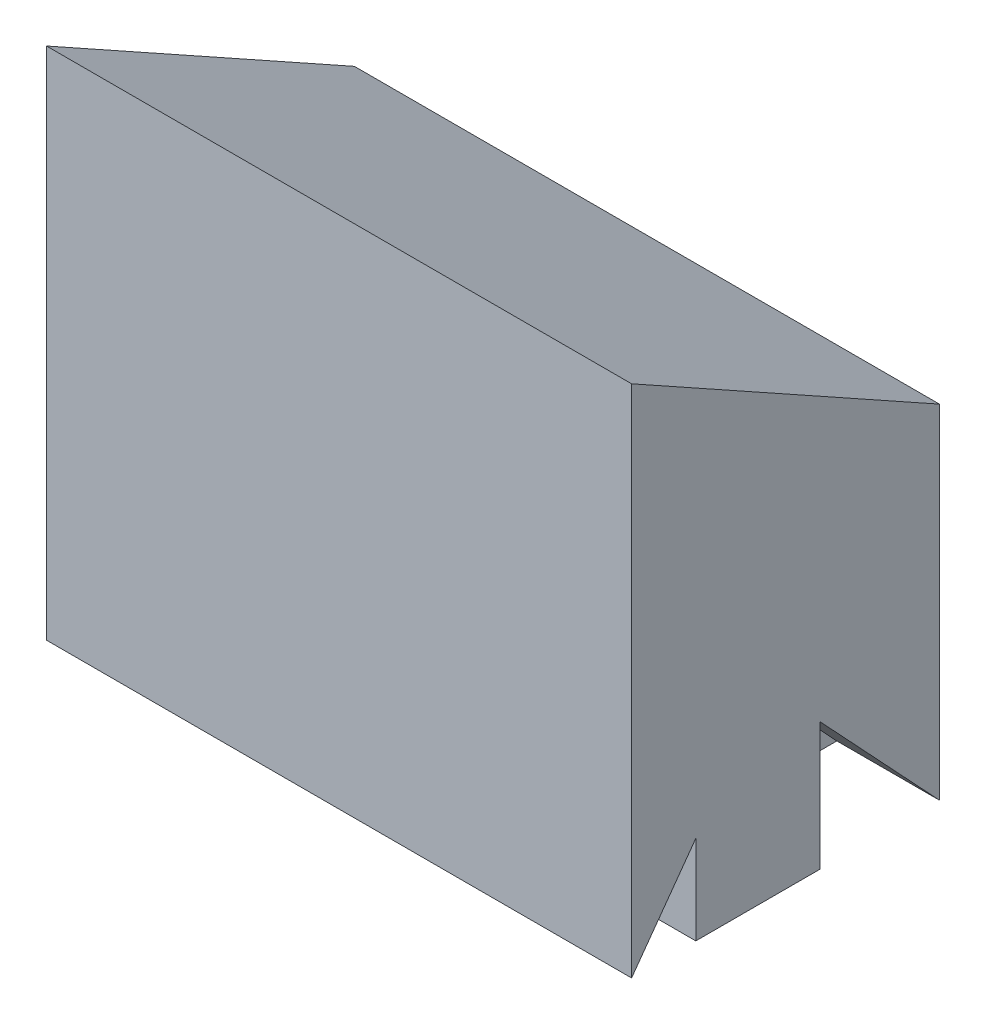
ISO-10303-21;
HEADER;
FILE_DESCRIPTION(('STEP AP214'),'2;1');
FILE_NAME('part.step','',(''),(''),'','','');
FILE_SCHEMA(('AUTOMOTIVE_DESIGN { 1 0 10303 214 1 1 1 1 }'));
ENDSEC;
DATA;
#1=APPLICATION_CONTEXT('core data for automotive mechanical design processes');
#2=APPLICATION_PROTOCOL_DEFINITION('international standard','automotive_design',2000,#1);
#3=PRODUCT_CONTEXT('',#1,'mechanical');
#4=PRODUCT('Part','Part','',(#3));
#5=PRODUCT_RELATED_PRODUCT_CATEGORY('part','',(#4));
#6=PRODUCT_DEFINITION_FORMATION('','',#4);
#7=PRODUCT_DEFINITION_CONTEXT('part definition',#1,'design');
#8=PRODUCT_DEFINITION('design','',#6,#7);
#9=PRODUCT_DEFINITION_SHAPE('','',#8);
#10=(LENGTH_UNIT() NAMED_UNIT(*) SI_UNIT(.MILLI.,.METRE.));
#11=(NAMED_UNIT(*) PLANE_ANGLE_UNIT() SI_UNIT($,.RADIAN.));
#12=(NAMED_UNIT(*) SI_UNIT($,.STERADIAN.) SOLID_ANGLE_UNIT());
#13=UNCERTAINTY_MEASURE_WITH_UNIT(LENGTH_MEASURE(1.E-05),#10,'distance_accuracy_value','');
#14=(GEOMETRIC_REPRESENTATION_CONTEXT(3) GLOBAL_UNCERTAINTY_ASSIGNED_CONTEXT((#13)) GLOBAL_UNIT_ASSIGNED_CONTEXT((#10,
#11,#12)) REPRESENTATION_CONTEXT('',''));
#15=CARTESIAN_POINT('',(0.,0.,0.));
#16=DIRECTION('',(0.,0.,1.));
#17=DIRECTION('',(1.,0.,0.));
#18=AXIS2_PLACEMENT_3D('',#15,#16,#17);
#19=CARTESIAN_POINT('',(0.,0.,30.));
#20=DIRECTION('',(0.,1.,0.));
#21=DIRECTION('',(0.,0.,1.));
#22=AXIS2_PLACEMENT_3D('',#19,#20,#21);
#23=PLANE('',#22);
#24=DIRECTION('',(0.,0.,-1.));
#25=VECTOR('',#24,1.);
#26=CARTESIAN_POINT('',(70.8577798786001,0.,30.));
#27=LINE('',#26,#25);
#28=CARTESIAN_POINT('',(70.8577798786001,0.,23.7428058885314));
#29=VERTEX_POINT('',#28);
#30=CARTESIAN_POINT('',(70.8577798786001,0.,11.6438199471961));
#31=VERTEX_POINT('',#30);
#32=EDGE_CURVE('E134',#29,#31,#27,.T.);
#33=ORIENTED_EDGE('',*,*,#32,.F.);
#34=DIRECTION('',(1.,0.,0.));
#35=VECTOR('',#34,1.);
#36=CARTESIAN_POINT('',(13.8495493312689,0.,23.7428058885314));
#37=LINE('',#36,#35);
#38=CARTESIAN_POINT('',(41.8495493312689,0.,23.7428058885314));
#39=VERTEX_POINT('',#38);
#40=EDGE_CURVE('E118',#39,#29,#37,.T.);
#41=ORIENTED_EDGE('',*,*,#40,.F.);
#42=DIRECTION('',(0.,0.,1.));
#43=VECTOR('',#42,1.);
#44=CARTESIAN_POINT('',(41.8495493312689,0.,20.2258421117634));
#45=LINE('',#44,#43);
#46=CARTESIAN_POINT('',(41.8495493312689,0.,20.2258421117634));
#47=VERTEX_POINT('',#46);
#48=EDGE_CURVE('E154',#47,#39,#45,.T.);
#49=ORIENTED_EDGE('',*,*,#48,.F.);
#50=DIRECTION('',(-1.,0.,0.));
#51=VECTOR('',#50,1.);
#52=CARTESIAN_POINT('',(41.8495493312689,0.,20.2258421117634));
#53=LINE('',#52,#51);
#54=CARTESIAN_POINT('',(13.8495493312689,0.,20.2258421117634));
#55=VERTEX_POINT('',#54);
#56=EDGE_CURVE('E170',#47,#55,#53,.T.);
#57=ORIENTED_EDGE('',*,*,#56,.T.);
#58=DIRECTION('',(0.,0.,-1.));
#59=VECTOR('',#58,1.);
#60=CARTESIAN_POINT('',(13.8495493312689,0.,30.));
#61=LINE('',#60,#59);
#62=CARTESIAN_POINT('',(13.8495493312689,0.,0.));
#63=VERTEX_POINT('',#62);
#64=EDGE_CURVE('E139',#55,#63,#61,.T.);
#65=ORIENTED_EDGE('',*,*,#64,.T.);
#66=DIRECTION('',(1.,0.,0.));
#67=VECTOR('',#66,1.);
#68=CARTESIAN_POINT('',(0.,0.,0.));
#69=LINE('',#68,#67);
#70=CARTESIAN_POINT('',(60.8577798786001,0.,0.));
#71=VERTEX_POINT('',#70);
#72=EDGE_CURVE('E205',#63,#71,#69,.T.);
#73=ORIENTED_EDGE('',*,*,#72,.T.);
#74=DIRECTION('',(0.,0.,-1.));
#75=VECTOR('',#74,1.);
#76=CARTESIAN_POINT('',(60.8577798786001,0.,0.));
#77=LINE('',#76,#75);
#78=CARTESIAN_POINT('',(60.8577798786001,0.,11.6438199471961));
#79=VERTEX_POINT('',#78);
#80=EDGE_CURVE('E58',#79,#71,#77,.T.);
#81=ORIENTED_EDGE('',*,*,#80,.F.);
#82=DIRECTION('',(1.,0.,0.));
#83=VECTOR('',#82,1.);
#84=CARTESIAN_POINT('',(60.8577798786001,0.,11.6438199471961));
#85=LINE('',#84,#83);
#86=EDGE_CURVE('E138',#79,#31,#85,.T.);
#87=ORIENTED_EDGE('',*,*,#86,.T.);
#88=EDGE_LOOP('',(#33,#41,#49,#57,#65,#73,#81,#87));
#89=FACE_BOUND('',#88,.T.);
#90=ADVANCED_FACE('F35',(#89),#23,.F.);
#91=CARTESIAN_POINT('',(70.8577798786001,0.,30.));
#92=DIRECTION('',(-1.,0.,0.));
#93=DIRECTION('',(0.,0.,1.));
#94=AXIS2_PLACEMENT_3D('',#91,#92,#93);
#95=PLANE('',#94);
#96=DIRECTION('',(0.,1.,0.));
#97=VECTOR('',#96,1.);
#98=CARTESIAN_POINT('',(70.8577798786001,0.,30.));
#99=LINE('',#98,#97);
#100=CARTESIAN_POINT('',(70.8577798786001,0.,30.));
#101=VERTEX_POINT('',#100);
#102=CARTESIAN_POINT('',(70.8577798786001,50.1420838183935,30.));
#103=VERTEX_POINT('',#102);
#104=EDGE_CURVE('E140',#101,#103,#99,.T.);
#105=ORIENTED_EDGE('',*,*,#104,.F.);
#106=DIRECTION('',(0.,-0.810438338951257,0.585823948603953));
#107=VECTOR('',#106,1.);
#108=CARTESIAN_POINT('',(70.8577798786001,0.,30.));
#109=LINE('',#108,#107);
#110=CARTESIAN_POINT('',(70.8577798786001,8.65630368010528,23.7428058885314));
#111=VERTEX_POINT('',#110);
#112=EDGE_CURVE('E128',#111,#101,#109,.T.);
#113=ORIENTED_EDGE('',*,*,#112,.F.);
#114=DIRECTION('',(0.,1.,0.));
#115=VECTOR('',#114,1.);
#116=CARTESIAN_POINT('',(70.8577798786001,8.65630368010528,23.7428058885314));
#117=LINE('',#116,#115);
#118=EDGE_CURVE('E121',#29,#111,#117,.T.);
#119=ORIENTED_EDGE('',*,*,#118,.F.);
#120=ORIENTED_EDGE('',*,*,#32,.T.);
#121=DIRECTION('',(0.,1.,0.));
#122=VECTOR('',#121,1.);
#123=CARTESIAN_POINT('',(70.8577798786001,0.,11.6438199471961));
#124=LINE('',#123,#122);
#125=CARTESIAN_POINT('',(70.8577798786001,12.4504065022994,11.6438199471961));
#126=VERTEX_POINT('',#125);
#127=EDGE_CURVE('E177',#31,#126,#124,.T.);
#128=ORIENTED_EDGE('',*,*,#127,.T.);
#129=DIRECTION('',(0.,-0.730368994284255,-0.683052803367504));
#130=VECTOR('',#129,1.);
#131=CARTESIAN_POINT('',(70.8577798786001,0.,0.));
#132=LINE('',#131,#130);
#133=CARTESIAN_POINT('',(70.8577798786001,0.,0.));
#134=VERTEX_POINT('',#133);
#135=EDGE_CURVE('E172',#126,#134,#132,.T.);
#136=ORIENTED_EDGE('',*,*,#135,.T.);
#137=DIRECTION('',(0.,1.,0.));
#138=VECTOR('',#137,1.);
#139=CARTESIAN_POINT('',(70.8577798786001,0.,0.));
#140=LINE('',#139,#138);
#141=CARTESIAN_POINT('',(70.8577798786001,33.4265318323234,0.));
#142=VERTEX_POINT('',#141);
#143=EDGE_CURVE('E147',#134,#142,#140,.T.);
#144=ORIENTED_EDGE('',*,*,#143,.T.);
#145=DIRECTION('',(0.,0.48673029562401,0.873552299133694));
#146=VECTOR('',#145,1.);
#147=CARTESIAN_POINT('',(70.8577798786001,50.1420838183935,30.));
#148=LINE('',#147,#146);
#149=EDGE_CURVE('E189',#142,#103,#148,.T.);
#150=ORIENTED_EDGE('',*,*,#149,.T.);
#151=EDGE_LOOP('',(#105,#113,#119,#120,#128,#136,#144,#150));
#152=FACE_BOUND('',#151,.T.);
#153=ADVANCED_FACE('F132',(#152),#95,.F.);
#154=CARTESIAN_POINT('',(13.8495493312689,0.,30.));
#155=DIRECTION('',(1.,0.,0.));
#156=DIRECTION('',(0.,1.,0.));
#157=AXIS2_PLACEMENT_3D('',#154,#155,#156);
#158=PLANE('',#157);
#159=ORIENTED_EDGE('',*,*,#64,.F.);
#160=DIRECTION('',(0.,-1.,0.));
#161=VECTOR('',#160,1.);
#162=CARTESIAN_POINT('',(13.8495493312689,16.6021424937348,20.2258421117634));
#163=LINE('',#162,#161);
#164=CARTESIAN_POINT('',(13.8495493312689,16.6021424937348,20.2258421117634));
#165=VERTEX_POINT('',#164);
#166=EDGE_CURVE('E159',#165,#55,#163,.T.);
#167=ORIENTED_EDGE('',*,*,#166,.F.);
#168=DIRECTION('',(0.,0.861748338110224,-0.507335985087069));
#169=VECTOR('',#168,1.);
#170=CARTESIAN_POINT('',(13.8495493312689,0.,30.));
#171=LINE('',#170,#169);
#172=CARTESIAN_POINT('',(13.8495493312689,0.,30.));
#173=VERTEX_POINT('',#172);
#174=EDGE_CURVE('E162',#173,#165,#171,.T.);
#175=ORIENTED_EDGE('',*,*,#174,.F.);
#176=DIRECTION('',(0.,-1.,0.));
#177=VECTOR('',#176,1.);
#178=CARTESIAN_POINT('',(13.8495493312689,0.,30.));
#179=LINE('',#178,#177);
#180=CARTESIAN_POINT('',(13.8495493312689,50.1420838183935,30.));
#181=VERTEX_POINT('',#180);
#182=EDGE_CURVE('E198',#181,#173,#179,.T.);
#183=ORIENTED_EDGE('',*,*,#182,.F.);
#184=DIRECTION('',(0.,0.48673029562401,0.873552299133694));
#185=VECTOR('',#184,1.);
#186=CARTESIAN_POINT('',(13.8495493312689,50.1420838183935,30.));
#187=LINE('',#186,#185);
#188=CARTESIAN_POINT('',(13.8495493312689,33.4265318323234,0.));
#189=VERTEX_POINT('',#188);
#190=EDGE_CURVE('E186',#189,#181,#187,.T.);
#191=ORIENTED_EDGE('',*,*,#190,.F.);
#192=DIRECTION('',(0.,-1.,0.));
#193=VECTOR('',#192,1.);
#194=CARTESIAN_POINT('',(13.8495493312689,0.,0.));
#195=LINE('',#194,#193);
#196=EDGE_CURVE('E195',#189,#63,#195,.T.);
#197=ORIENTED_EDGE('',*,*,#196,.T.);
#198=EDGE_LOOP('',(#159,#167,#175,#183,#191,#197));
#199=FACE_BOUND('',#198,.T.);
#200=ADVANCED_FACE('F37',(#199),#158,.F.);
#201=CARTESIAN_POINT('',(0.,0.,30.));
#202=DIRECTION('',(0.,0.,1.));
#203=DIRECTION('',(1.,0.,0.));
#204=AXIS2_PLACEMENT_3D('',#201,#202,#203);
#205=PLANE('',#204);
#206=DIRECTION('',(1.,0.,0.));
#207=VECTOR('',#206,1.);
#208=CARTESIAN_POINT('',(0.,50.1420838183935,30.));
#209=LINE('',#208,#207);
#210=EDGE_CURVE('E196',#181,#103,#209,.T.);
#211=ORIENTED_EDGE('',*,*,#210,.F.);
#212=ORIENTED_EDGE('',*,*,#182,.T.);
#213=DIRECTION('',(1.,0.,0.));
#214=VECTOR('',#213,1.);
#215=CARTESIAN_POINT('',(0.,0.,30.));
#216=LINE('',#215,#214);
#217=CARTESIAN_POINT('',(41.8495493312689,0.,30.));
#218=VERTEX_POINT('',#217);
#219=EDGE_CURVE('E144',#173,#218,#216,.T.);
#220=ORIENTED_EDGE('',*,*,#219,.T.);
#221=EDGE_CURVE('E201',#218,#101,#216,.T.);
#222=ORIENTED_EDGE('',*,*,#221,.T.);
#223=ORIENTED_EDGE('',*,*,#104,.T.);
#224=EDGE_LOOP('',(#211,#212,#220,#222,#223));
#225=FACE_BOUND('',#224,.T.);
#226=ADVANCED_FACE('F226',(#225),#205,.T.);
#227=CARTESIAN_POINT('',(0.,0.,0.));
#228=DIRECTION('',(0.,0.,1.));
#229=DIRECTION('',(1.,0.,0.));
#230=AXIS2_PLACEMENT_3D('',#227,#228,#229);
#231=PLANE('',#230);
#232=ORIENTED_EDGE('',*,*,#196,.F.);
#233=DIRECTION('',(-1.,0.,0.));
#234=VECTOR('',#233,1.);
#235=CARTESIAN_POINT('',(70.8577798786001,33.4265318323234,0.));
#236=LINE('',#235,#234);
#237=EDGE_CURVE('E192',#142,#189,#236,.T.);
#238=ORIENTED_EDGE('',*,*,#237,.F.);
#239=ORIENTED_EDGE('',*,*,#143,.F.);
#240=DIRECTION('',(1.,0.,0.));
#241=VECTOR('',#240,1.);
#242=CARTESIAN_POINT('',(60.8577798786001,0.,0.));
#243=LINE('',#242,#241);
#244=EDGE_CURVE('E184',#71,#134,#243,.T.);
#245=ORIENTED_EDGE('',*,*,#244,.F.);
#246=ORIENTED_EDGE('',*,*,#72,.F.);
#247=EDGE_LOOP('',(#232,#238,#239,#245,#246));
#248=FACE_BOUND('',#247,.T.);
#249=ADVANCED_FACE('F215',(#248),#231,.F.);
#250=CARTESIAN_POINT('',(70.8577798786001,50.1420838183935,30.));
#251=DIRECTION('',(0.,-0.873552299133694,0.48673029562401));
#252=DIRECTION('',(0.,-0.48673029562401,-0.873552299133695));
#253=AXIS2_PLACEMENT_3D('',#250,#251,#252);
#254=PLANE('',#253);
#255=ORIENTED_EDGE('',*,*,#190,.T.);
#256=ORIENTED_EDGE('',*,*,#210,.T.);
#257=ORIENTED_EDGE('',*,*,#149,.F.);
#258=ORIENTED_EDGE('',*,*,#237,.T.);
#259=EDGE_LOOP('',(#255,#256,#257,#258));
#260=FACE_BOUND('',#259,.T.);
#261=ADVANCED_FACE('F218',(#260),#254,.F.);
#262=CARTESIAN_POINT('',(60.8577798786001,0.,0.));
#263=DIRECTION('',(0.,-0.683052803367504,0.730368994284255));
#264=DIRECTION('',(0.,-0.730368994284255,-0.683052803367504));
#265=AXIS2_PLACEMENT_3D('',#262,#263,#264);
#266=PLANE('',#265);
#267=ORIENTED_EDGE('',*,*,#135,.F.);
#268=DIRECTION('',(1.,0.,0.));
#269=VECTOR('',#268,1.);
#270=CARTESIAN_POINT('',(60.8577798786001,12.4504065022994,11.6438199471961));
#271=LINE('',#270,#269);
#272=CARTESIAN_POINT('',(60.8577798786001,12.4504065022994,11.6438199471961));
#273=VERTEX_POINT('',#272);
#274=EDGE_CURVE('E180',#273,#126,#271,.T.);
#275=ORIENTED_EDGE('',*,*,#274,.F.);
#276=DIRECTION('',(0.,-0.730368994284255,-0.683052803367504));
#277=VECTOR('',#276,1.);
#278=CARTESIAN_POINT('',(60.8577798786001,0.,0.));
#279=LINE('',#278,#277);
#280=EDGE_CURVE('E174',#273,#71,#279,.T.);
#281=ORIENTED_EDGE('',*,*,#280,.T.);
#282=ORIENTED_EDGE('',*,*,#244,.T.);
#283=EDGE_LOOP('',(#267,#275,#281,#282));
#284=FACE_BOUND('',#283,.T.);
#285=ADVANCED_FACE('F252',(#284),#266,.T.);
#286=CARTESIAN_POINT('',(60.8577798786001,0.,11.6438199471961));
#287=DIRECTION('',(0.,0.,-1.));
#288=DIRECTION('',(-1.,0.,0.));
#289=AXIS2_PLACEMENT_3D('',#286,#287,#288);
#290=PLANE('',#289);
#291=ORIENTED_EDGE('',*,*,#127,.F.);
#292=ORIENTED_EDGE('',*,*,#86,.F.);
#293=DIRECTION('',(0.,1.,0.));
#294=VECTOR('',#293,1.);
#295=CARTESIAN_POINT('',(60.8577798786001,0.,11.6438199471961));
#296=LINE('',#295,#294);
#297=EDGE_CURVE('E176',#79,#273,#296,.T.);
#298=ORIENTED_EDGE('',*,*,#297,.T.);
#299=ORIENTED_EDGE('',*,*,#274,.T.);
#300=EDGE_LOOP('',(#291,#292,#298,#299));
#301=FACE_BOUND('',#300,.T.);
#302=ADVANCED_FACE('F255',(#301),#290,.T.);
#303=CARTESIAN_POINT('',(60.8577798786001,0.,0.));
#304=DIRECTION('',(1.,0.,0.));
#305=DIRECTION('',(0.,0.,-1.));
#306=AXIS2_PLACEMENT_3D('',#303,#304,#305);
#307=PLANE('',#306);
#308=ORIENTED_EDGE('',*,*,#280,.F.);
#309=ORIENTED_EDGE('',*,*,#297,.F.);
#310=ORIENTED_EDGE('',*,*,#80,.T.);
#311=EDGE_LOOP('',(#308,#309,#310));
#312=FACE_BOUND('',#311,.T.);
#313=ADVANCED_FACE('F259',(#312),#307,.T.);
#314=CARTESIAN_POINT('',(41.8495493312689,16.6021424937348,20.2258421117634));
#315=DIRECTION('',(0.,0.,-1.));
#316=DIRECTION('',(-1.,0.,0.));
#317=AXIS2_PLACEMENT_3D('',#314,#315,#316);
#318=PLANE('',#317);
#319=ORIENTED_EDGE('',*,*,#166,.T.);
#320=ORIENTED_EDGE('',*,*,#56,.F.);
#321=DIRECTION('',(0.,-1.,0.));
#322=VECTOR('',#321,1.);
#323=CARTESIAN_POINT('',(41.8495493312689,16.6021424937348,20.2258421117634));
#324=LINE('',#323,#322);
#325=CARTESIAN_POINT('',(41.8495493312689,16.6021424937348,20.2258421117634));
#326=VERTEX_POINT('',#325);
#327=EDGE_CURVE('E156',#326,#47,#324,.T.);
#328=ORIENTED_EDGE('',*,*,#327,.F.);
#329=DIRECTION('',(-1.,0.,0.));
#330=VECTOR('',#329,1.);
#331=CARTESIAN_POINT('',(41.8495493312689,16.6021424937348,20.2258421117634));
#332=LINE('',#331,#330);
#333=EDGE_CURVE('E167',#326,#165,#332,.T.);
#334=ORIENTED_EDGE('',*,*,#333,.T.);
#335=EDGE_LOOP('',(#319,#320,#328,#334));
#336=FACE_BOUND('',#335,.T.);
#337=ADVANCED_FACE('F263',(#336),#318,.F.);
#338=CARTESIAN_POINT('',(41.8495493312689,0.,30.));
#339=DIRECTION('',(0.,0.507335985087069,0.861748338110224));
#340=DIRECTION('',(0.,-0.861748338110224,0.50733598508707));
#341=AXIS2_PLACEMENT_3D('',#338,#339,#340);
#342=PLANE('',#341);
#343=ORIENTED_EDGE('',*,*,#174,.T.);
#344=ORIENTED_EDGE('',*,*,#333,.F.);
#345=DIRECTION('',(0.,0.861748338110224,-0.507335985087069));
#346=VECTOR('',#345,1.);
#347=CARTESIAN_POINT('',(41.8495493312689,0.,30.));
#348=LINE('',#347,#346);
#349=EDGE_CURVE('E158',#218,#326,#348,.T.);
#350=ORIENTED_EDGE('',*,*,#349,.F.);
#351=ORIENTED_EDGE('',*,*,#219,.F.);
#352=EDGE_LOOP('',(#343,#344,#350,#351));
#353=FACE_BOUND('',#352,.T.);
#354=ADVANCED_FACE('F238',(#353),#342,.F.);
#355=CARTESIAN_POINT('',(41.8495493312689,0.,0.));
#356=DIRECTION('',(1.,0.,0.));
#357=DIRECTION('',(0.,1.,0.));
#358=AXIS2_PLACEMENT_3D('',#355,#356,#357);
#359=PLANE('',#358);
#360=DIRECTION('',(0.,1.,0.));
#361=VECTOR('',#360,1.);
#362=CARTESIAN_POINT('',(41.8495493312689,0.,23.7428058885314));
#363=LINE('',#362,#361);
#364=CARTESIAN_POINT('',(41.8495493312689,8.65630368010528,23.7428058885314));
#365=VERTEX_POINT('',#364);
#366=EDGE_CURVE('E43',#39,#365,#363,.T.);
#367=ORIENTED_EDGE('',*,*,#366,.T.);
#368=DIRECTION('',(0.,-0.810438338951257,0.585823948603953));
#369=VECTOR('',#368,1.);
#370=CARTESIAN_POINT('',(41.8495493312689,14.2432256347336,19.7043090372622));
#371=LINE('',#370,#369);
#372=EDGE_CURVE('E11',#365,#218,#371,.T.);
#373=ORIENTED_EDGE('',*,*,#372,.T.);
#374=ORIENTED_EDGE('',*,*,#349,.T.);
#375=ORIENTED_EDGE('',*,*,#327,.T.);
#376=ORIENTED_EDGE('',*,*,#48,.T.);
#377=EDGE_LOOP('',(#367,#373,#374,#375,#376));
#378=FACE_BOUND('',#377,.T.);
#379=ADVANCED_FACE('F150',(#378),#359,.F.);
#380=CARTESIAN_POINT('',(13.8495493312689,0.,30.));
#381=DIRECTION('',(0.,0.585823948603953,0.810438338951257));
#382=DIRECTION('',(0.,-0.810438338951257,0.585823948603953));
#383=AXIS2_PLACEMENT_3D('',#380,#381,#382);
#384=PLANE('',#383);
#385=DIRECTION('',(1.,0.,0.));
#386=VECTOR('',#385,1.);
#387=CARTESIAN_POINT('',(13.8495493312689,8.65630368010528,23.7428058885314));
#388=LINE('',#387,#386);
#389=EDGE_CURVE('E50',#365,#111,#388,.T.);
#390=ORIENTED_EDGE('',*,*,#389,.T.);
#391=ORIENTED_EDGE('',*,*,#112,.T.);
#392=ORIENTED_EDGE('',*,*,#221,.F.);
#393=ORIENTED_EDGE('',*,*,#372,.F.);
#394=EDGE_LOOP('',(#390,#391,#392,#393));
#395=FACE_BOUND('',#394,.T.);
#396=ADVANCED_FACE('F229',(#395),#384,.F.);
#397=CARTESIAN_POINT('',(13.8495493312689,8.65630368010528,23.7428058885314));
#398=DIRECTION('',(0.,0.,-1.));
#399=DIRECTION('',(-1.,0.,0.));
#400=AXIS2_PLACEMENT_3D('',#397,#398,#399);
#401=PLANE('',#400);
#402=ORIENTED_EDGE('',*,*,#40,.T.);
#403=ORIENTED_EDGE('',*,*,#118,.T.);
#404=ORIENTED_EDGE('',*,*,#389,.F.);
#405=ORIENTED_EDGE('',*,*,#366,.F.);
#406=EDGE_LOOP('',(#402,#403,#404,#405));
#407=FACE_BOUND('',#406,.T.);
#408=ADVANCED_FACE('F120',(#407),#401,.F.);
#409=CLOSED_SHELL('',(#90,#153,#200,#226,#249,#261,#285,#302,#313,#337,#354,#379,#396,#408));
#410=MANIFOLD_SOLID_BREP('B2',#409);
#411=ADVANCED_BREP_SHAPE_REPRESENTATION('',(#18,#410),#14);
#412=SHAPE_DEFINITION_REPRESENTATION(#9,#411);
ENDSEC;
END-ISO-10303-21;
